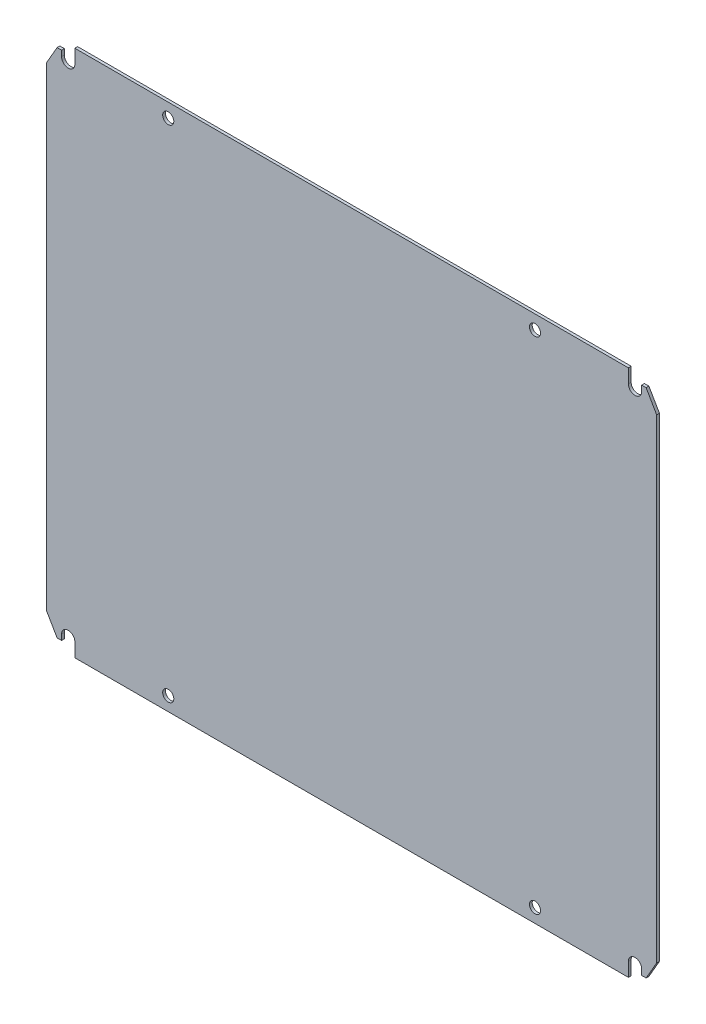
ISO-10303-21;
HEADER;
FILE_DESCRIPTION(('STEP AP214'),'2;1');
FILE_NAME('part.step','',(''),(''),'','','');
FILE_SCHEMA(('AUTOMOTIVE_DESIGN { 1 0 10303 214 1 1 1 1 }'));
ENDSEC;
DATA;
#1=APPLICATION_CONTEXT('core data for automotive mechanical design processes');
#2=APPLICATION_PROTOCOL_DEFINITION('international standard','automotive_design',2000,#1);
#3=PRODUCT_CONTEXT('',#1,'mechanical');
#4=PRODUCT('Part','Part','',(#3));
#5=PRODUCT_RELATED_PRODUCT_CATEGORY('part','',(#4));
#6=PRODUCT_DEFINITION_FORMATION('','',#4);
#7=PRODUCT_DEFINITION_CONTEXT('part definition',#1,'design');
#8=PRODUCT_DEFINITION('design','',#6,#7);
#9=PRODUCT_DEFINITION_SHAPE('','',#8);
#10=(LENGTH_UNIT() NAMED_UNIT(*) SI_UNIT(.MILLI.,.METRE.));
#11=(NAMED_UNIT(*) PLANE_ANGLE_UNIT() SI_UNIT($,.RADIAN.));
#12=(NAMED_UNIT(*) SI_UNIT($,.STERADIAN.) SOLID_ANGLE_UNIT());
#13=UNCERTAINTY_MEASURE_WITH_UNIT(LENGTH_MEASURE(1.E-05),#10,'distance_accuracy_value','');
#14=(GEOMETRIC_REPRESENTATION_CONTEXT(3) GLOBAL_UNCERTAINTY_ASSIGNED_CONTEXT((#13)) GLOBAL_UNIT_ASSIGNED_CONTEXT((#10,
#11,#12)) REPRESENTATION_CONTEXT('',''));
#15=CARTESIAN_POINT('',(0.,0.,0.));
#16=DIRECTION('',(0.,0.,1.));
#17=DIRECTION('',(1.,0.,0.));
#18=AXIS2_PLACEMENT_3D('',#15,#16,#17);
#19=CARTESIAN_POINT('',(-255.,0.,-2.5));
#20=DIRECTION('',(0.,0.,1.));
#21=DIRECTION('',(1.,0.,0.));
#22=AXIS2_PLACEMENT_3D('',#19,#20,#21);
#23=PLANE('',#22);
#24=DIRECTION('',(-0.500000000000001,-0.866025403784438,0.));
#25=VECTOR('',#24,1.);
#26=CARTESIAN_POINT('',(-265.,455.,-2.5));
#27=LINE('',#26,#25);
#28=CARTESIAN_POINT('',(-265.,455.,-2.5));
#29=VERTEX_POINT('',#28);
#30=CARTESIAN_POINT('',(-274.5,438.545517328096,-2.5));
#31=VERTEX_POINT('',#30);
#32=EDGE_CURVE('E240',#29,#31,#27,.T.);
#33=ORIENTED_EDGE('',*,*,#32,.F.);
#34=DIRECTION('',(1.,0.,0.));
#35=VECTOR('',#34,1.);
#36=CARTESIAN_POINT('',(-261.,455.,-2.5));
#37=LINE('',#36,#35);
#38=CARTESIAN_POINT('',(-261.,455.,-2.5));
#39=VERTEX_POINT('',#38);
#40=EDGE_CURVE('E254',#39,#29,#37,.F.);
#41=ORIENTED_EDGE('',*,*,#40,.F.);
#42=DIRECTION('',(0.,1.,0.));
#43=VECTOR('',#42,1.);
#44=CARTESIAN_POINT('',(-261.,450.,-2.5));
#45=LINE('',#44,#43);
#46=CARTESIAN_POINT('',(-261.,450.,-2.5));
#47=VERTEX_POINT('',#46);
#48=EDGE_CURVE('E261',#47,#39,#45,.T.);
#49=ORIENTED_EDGE('',*,*,#48,.F.);
#50=CARTESIAN_POINT('',(-255.,450.,-2.5));
#51=DIRECTION('',(0.,0.,-1.));
#52=DIRECTION('',(-1.,0.,0.));
#53=AXIS2_PLACEMENT_3D('',#50,#51,#52);
#54=CIRCLE('',#53,6.00000000000001);
#55=CARTESIAN_POINT('',(-249.,450.,-2.5));
#56=VERTEX_POINT('',#55);
#57=EDGE_CURVE('E269',#47,#56,#54,.F.);
#58=ORIENTED_EDGE('',*,*,#57,.T.);
#59=DIRECTION('',(0.,1.,0.));
#60=VECTOR('',#59,1.);
#61=CARTESIAN_POINT('',(-249.,462.5,-2.5));
#62=LINE('',#61,#60);
#63=CARTESIAN_POINT('',(-249.,462.5,-2.5));
#64=VERTEX_POINT('',#63);
#65=EDGE_CURVE('E266',#64,#56,#62,.F.);
#66=ORIENTED_EDGE('',*,*,#65,.F.);
#67=DIRECTION('',(1.,0.,0.));
#68=VECTOR('',#67,1.);
#69=CARTESIAN_POINT('',(249.,462.5,-2.5));
#70=LINE('',#69,#68);
#71=CARTESIAN_POINT('',(249.,462.5,-2.5));
#72=VERTEX_POINT('',#71);
#73=EDGE_CURVE('E273',#72,#64,#70,.F.);
#74=ORIENTED_EDGE('',*,*,#73,.F.);
#75=DIRECTION('',(0.,1.,0.));
#76=VECTOR('',#75,1.);
#77=CARTESIAN_POINT('',(249.,450.,-2.5));
#78=LINE('',#77,#76);
#79=CARTESIAN_POINT('',(249.,450.,-2.5));
#80=VERTEX_POINT('',#79);
#81=EDGE_CURVE('E278',#80,#72,#78,.T.);
#82=ORIENTED_EDGE('',*,*,#81,.F.);
#83=CARTESIAN_POINT('',(255.,450.,-2.5));
#84=DIRECTION('',(0.,0.,-1.));
#85=DIRECTION('',(-1.,0.,0.));
#86=AXIS2_PLACEMENT_3D('',#83,#84,#85);
#87=CIRCLE('',#86,6.00000000000001);
#88=CARTESIAN_POINT('',(261.,450.,-2.5));
#89=VERTEX_POINT('',#88);
#90=EDGE_CURVE('E286',#80,#89,#87,.F.);
#91=ORIENTED_EDGE('',*,*,#90,.T.);
#92=DIRECTION('',(0.,1.,0.));
#93=VECTOR('',#92,1.);
#94=CARTESIAN_POINT('',(261.,455.,-2.5));
#95=LINE('',#94,#93);
#96=CARTESIAN_POINT('',(261.,455.,-2.5));
#97=VERTEX_POINT('',#96);
#98=EDGE_CURVE('E283',#97,#89,#95,.F.);
#99=ORIENTED_EDGE('',*,*,#98,.F.);
#100=DIRECTION('',(1.,0.,0.));
#101=VECTOR('',#100,1.);
#102=CARTESIAN_POINT('',(265.,455.,-2.5));
#103=LINE('',#102,#101);
#104=CARTESIAN_POINT('',(265.,455.,-2.5));
#105=VERTEX_POINT('',#104);
#106=EDGE_CURVE('E290',#105,#97,#103,.F.);
#107=ORIENTED_EDGE('',*,*,#106,.F.);
#108=DIRECTION('',(-0.500000000000001,0.866025403784438,0.));
#109=VECTOR('',#108,1.);
#110=CARTESIAN_POINT('',(274.5,438.545517328096,-2.5));
#111=LINE('',#110,#109);
#112=CARTESIAN_POINT('',(274.5,438.545517328096,-2.5));
#113=VERTEX_POINT('',#112);
#114=EDGE_CURVE('E295',#113,#105,#111,.T.);
#115=ORIENTED_EDGE('',*,*,#114,.F.);
#116=DIRECTION('',(0.,1.,0.));
#117=VECTOR('',#116,1.);
#118=CARTESIAN_POINT('',(274.5,11.4544826719043,-2.5));
#119=LINE('',#118,#117);
#120=CARTESIAN_POINT('',(274.5,11.4544826719043,-2.5));
#121=VERTEX_POINT('',#120);
#122=EDGE_CURVE('E300',#121,#113,#119,.T.);
#123=ORIENTED_EDGE('',*,*,#122,.F.);
#124=DIRECTION('',(0.500000000000001,0.866025403784438,0.));
#125=VECTOR('',#124,1.);
#126=CARTESIAN_POINT('',(265.,-5.,-2.5));
#127=LINE('',#126,#125);
#128=CARTESIAN_POINT('',(265.,-5.,-2.5));
#129=VERTEX_POINT('',#128);
#130=EDGE_CURVE('E305',#129,#121,#127,.T.);
#131=ORIENTED_EDGE('',*,*,#130,.F.);
#132=DIRECTION('',(1.,0.,0.));
#133=VECTOR('',#132,1.);
#134=CARTESIAN_POINT('',(261.,-5.,-2.5));
#135=LINE('',#134,#133);
#136=CARTESIAN_POINT('',(261.,-5.,-2.5));
#137=VERTEX_POINT('',#136);
#138=EDGE_CURVE('E310',#137,#129,#135,.T.);
#139=ORIENTED_EDGE('',*,*,#138,.F.);
#140=DIRECTION('',(0.,1.,0.));
#141=VECTOR('',#140,1.);
#142=CARTESIAN_POINT('',(261.,0.,-2.5));
#143=LINE('',#142,#141);
#144=CARTESIAN_POINT('',(261.,0.,-2.5));
#145=VERTEX_POINT('',#144);
#146=EDGE_CURVE('E315',#145,#137,#143,.F.);
#147=ORIENTED_EDGE('',*,*,#146,.F.);
#148=CARTESIAN_POINT('',(255.,0.,-2.5));
#149=DIRECTION('',(0.,0.,-1.));
#150=DIRECTION('',(-1.,0.,0.));
#151=AXIS2_PLACEMENT_3D('',#148,#149,#150);
#152=CIRCLE('',#151,6.00000000000001);
#153=CARTESIAN_POINT('',(249.,0.,-2.5));
#154=VERTEX_POINT('',#153);
#155=EDGE_CURVE('E323',#145,#154,#152,.F.);
#156=ORIENTED_EDGE('',*,*,#155,.T.);
#157=DIRECTION('',(0.,1.,0.));
#158=VECTOR('',#157,1.);
#159=CARTESIAN_POINT('',(249.,-12.5,-2.5));
#160=LINE('',#159,#158);
#161=CARTESIAN_POINT('',(249.,-12.5,-2.5));
#162=VERTEX_POINT('',#161);
#163=EDGE_CURVE('E320',#162,#154,#160,.T.);
#164=ORIENTED_EDGE('',*,*,#163,.F.);
#165=DIRECTION('',(1.,0.,0.));
#166=VECTOR('',#165,1.);
#167=CARTESIAN_POINT('',(-249.,-12.5,-2.5));
#168=LINE('',#167,#166);
#169=CARTESIAN_POINT('',(-249.,-12.5,-2.5));
#170=VERTEX_POINT('',#169);
#171=EDGE_CURVE('E327',#170,#162,#168,.T.);
#172=ORIENTED_EDGE('',*,*,#171,.F.);
#173=DIRECTION('',(0.,1.,0.));
#174=VECTOR('',#173,1.);
#175=CARTESIAN_POINT('',(-249.,0.,-2.5));
#176=LINE('',#175,#174);
#177=CARTESIAN_POINT('',(-249.,0.,-2.5));
#178=VERTEX_POINT('',#177);
#179=EDGE_CURVE('E184',#178,#170,#176,.F.);
#180=ORIENTED_EDGE('',*,*,#179,.F.);
#181=CARTESIAN_POINT('',(-255.,0.,-2.5));
#182=DIRECTION('',(0.,0.,-1.));
#183=DIRECTION('',(-1.,0.,0.));
#184=AXIS2_PLACEMENT_3D('',#181,#182,#183);
#185=CIRCLE('',#184,6.00000000000001);
#186=CARTESIAN_POINT('',(-261.,0.,-2.5));
#187=VERTEX_POINT('',#186);
#188=EDGE_CURVE('E173',#178,#187,#185,.F.);
#189=ORIENTED_EDGE('',*,*,#188,.T.);
#190=DIRECTION('',(0.,1.,0.));
#191=VECTOR('',#190,1.);
#192=CARTESIAN_POINT('',(-261.,-5.,-2.5));
#193=LINE('',#192,#191);
#194=CARTESIAN_POINT('',(-261.,-5.,-2.5));
#195=VERTEX_POINT('',#194);
#196=EDGE_CURVE('E181',#195,#187,#193,.T.);
#197=ORIENTED_EDGE('',*,*,#196,.F.);
#198=DIRECTION('',(1.,0.,0.));
#199=VECTOR('',#198,1.);
#200=CARTESIAN_POINT('',(-265.,-5.,-2.5));
#201=LINE('',#200,#199);
#202=CARTESIAN_POINT('',(-265.,-5.,-2.5));
#203=VERTEX_POINT('',#202);
#204=EDGE_CURVE('E204',#203,#195,#201,.T.);
#205=ORIENTED_EDGE('',*,*,#204,.F.);
#206=DIRECTION('',(0.500000000000001,-0.866025403784438,0.));
#207=VECTOR('',#206,1.);
#208=CARTESIAN_POINT('',(-274.5,11.4544826719043,-2.5));
#209=LINE('',#208,#207);
#210=CARTESIAN_POINT('',(-274.5,11.4544826719043,-2.5));
#211=VERTEX_POINT('',#210);
#212=EDGE_CURVE('E217',#211,#203,#209,.T.);
#213=ORIENTED_EDGE('',*,*,#212,.F.);
#214=DIRECTION('',(0.,1.,0.));
#215=VECTOR('',#214,1.);
#216=CARTESIAN_POINT('',(-274.5,438.545517328096,-2.5));
#217=LINE('',#216,#215);
#218=EDGE_CURVE('E228',#31,#211,#217,.F.);
#219=ORIENTED_EDGE('',*,*,#218,.F.);
#220=EDGE_LOOP('',(#33,#41,#49,#58,#66,#74,#82,#91,#99,#107,#115,#123,#131,#139,#147,#156,#164,
#172,#180,#189,#197,#205,#213,#219));
#221=FACE_BOUND('',#220,.T.);
#222=CARTESIAN_POINT('',(165.,0.,-2.5));
#223=DIRECTION('',(0.,0.,-1.));
#224=DIRECTION('',(-1.,0.,0.));
#225=AXIS2_PLACEMENT_3D('',#222,#223,#224);
#226=CIRCLE('',#225,5.);
#227=CARTESIAN_POINT('',(160.,0.,-2.5));
#228=VERTEX_POINT('',#227);
#229=EDGE_CURVE('E246',#228,#228,#226,.F.);
#230=ORIENTED_EDGE('',*,*,#229,.T.);
#231=EDGE_LOOP('',(#230));
#232=FACE_BOUND('',#231,.T.);
#233=CARTESIAN_POINT('',(165.,450.,-2.5));
#234=DIRECTION('',(0.,0.,-1.));
#235=DIRECTION('',(-1.,0.,0.));
#236=AXIS2_PLACEMENT_3D('',#233,#234,#235);
#237=CIRCLE('',#236,5.);
#238=CARTESIAN_POINT('',(160.,450.,-2.5));
#239=VERTEX_POINT('',#238);
#240=EDGE_CURVE('E378',#239,#239,#237,.F.);
#241=ORIENTED_EDGE('',*,*,#240,.T.);
#242=EDGE_LOOP('',(#241));
#243=FACE_BOUND('',#242,.T.);
#244=CARTESIAN_POINT('',(-165.,0.,-2.5));
#245=DIRECTION('',(0.,0.,-1.));
#246=DIRECTION('',(-1.,0.,0.));
#247=AXIS2_PLACEMENT_3D('',#244,#245,#246);
#248=CIRCLE('',#247,5.);
#249=CARTESIAN_POINT('',(-170.,0.,-2.5));
#250=VERTEX_POINT('',#249);
#251=EDGE_CURVE('E380',#250,#250,#248,.F.);
#252=ORIENTED_EDGE('',*,*,#251,.T.);
#253=EDGE_LOOP('',(#252));
#254=FACE_BOUND('',#253,.T.);
#255=CARTESIAN_POINT('',(-165.,450.,-2.5));
#256=DIRECTION('',(0.,0.,-1.));
#257=DIRECTION('',(-1.,0.,0.));
#258=AXIS2_PLACEMENT_3D('',#255,#256,#257);
#259=CIRCLE('',#258,5.);
#260=CARTESIAN_POINT('',(-170.,450.,-2.5));
#261=VERTEX_POINT('',#260);
#262=EDGE_CURVE('E19',#261,#261,#259,.F.);
#263=ORIENTED_EDGE('',*,*,#262,.T.);
#264=EDGE_LOOP('',(#263));
#265=FACE_BOUND('',#264,.T.);
#266=ADVANCED_FACE('F16',(#221,#232,#243,#254,#265),#23,.F.);
#267=CARTESIAN_POINT('',(-165.,450.,-2.5));
#268=DIRECTION('',(0.,0.,-1.));
#269=DIRECTION('',(-1.,0.,0.));
#270=AXIS2_PLACEMENT_3D('',#267,#268,#269);
#271=CYLINDRICAL_SURFACE('',#270,5.);
#272=CARTESIAN_POINT('',(-165.,450.,0.));
#273=DIRECTION('',(0.,0.,-1.));
#274=DIRECTION('',(-1.,0.,0.));
#275=AXIS2_PLACEMENT_3D('',#272,#273,#274);
#276=CIRCLE('',#275,5.);
#277=CARTESIAN_POINT('',(-170.,450.,0.));
#278=VERTEX_POINT('',#277);
#279=EDGE_CURVE('E239',#278,#278,#276,.T.);
#280=ORIENTED_EDGE('',*,*,#279,.F.);
#281=EDGE_LOOP('',(#280));
#282=FACE_BOUND('',#281,.T.);
#283=ORIENTED_EDGE('',*,*,#262,.F.);
#284=EDGE_LOOP('',(#283));
#285=FACE_BOUND('',#284,.T.);
#286=ADVANCED_FACE('F388',(#282,#285),#271,.F.);
#287=CARTESIAN_POINT('',(-165.,0.,-2.5));
#288=DIRECTION('',(0.,0.,-1.));
#289=DIRECTION('',(-1.,0.,0.));
#290=AXIS2_PLACEMENT_3D('',#287,#288,#289);
#291=CYLINDRICAL_SURFACE('',#290,5.);
#292=CARTESIAN_POINT('',(-165.,0.,0.));
#293=DIRECTION('',(0.,0.,-1.));
#294=DIRECTION('',(-1.,0.,0.));
#295=AXIS2_PLACEMENT_3D('',#292,#293,#294);
#296=CIRCLE('',#295,5.);
#297=CARTESIAN_POINT('',(-170.,0.,0.));
#298=VERTEX_POINT('',#297);
#299=EDGE_CURVE('E365',#298,#298,#296,.T.);
#300=ORIENTED_EDGE('',*,*,#299,.F.);
#301=EDGE_LOOP('',(#300));
#302=FACE_BOUND('',#301,.T.);
#303=ORIENTED_EDGE('',*,*,#251,.F.);
#304=EDGE_LOOP('',(#303));
#305=FACE_BOUND('',#304,.T.);
#306=ADVANCED_FACE('F390',(#302,#305),#291,.F.);
#307=CARTESIAN_POINT('',(165.,450.,-2.5));
#308=DIRECTION('',(0.,0.,-1.));
#309=DIRECTION('',(-1.,0.,0.));
#310=AXIS2_PLACEMENT_3D('',#307,#308,#309);
#311=CYLINDRICAL_SURFACE('',#310,5.);
#312=CARTESIAN_POINT('',(165.,450.,0.));
#313=DIRECTION('',(0.,0.,-1.));
#314=DIRECTION('',(-1.,0.,0.));
#315=AXIS2_PLACEMENT_3D('',#312,#313,#314);
#316=CIRCLE('',#315,5.);
#317=CARTESIAN_POINT('',(160.,450.,0.));
#318=VERTEX_POINT('',#317);
#319=EDGE_CURVE('E362',#318,#318,#316,.T.);
#320=ORIENTED_EDGE('',*,*,#319,.F.);
#321=EDGE_LOOP('',(#320));
#322=FACE_BOUND('',#321,.T.);
#323=ORIENTED_EDGE('',*,*,#240,.F.);
#324=EDGE_LOOP('',(#323));
#325=FACE_BOUND('',#324,.T.);
#326=ADVANCED_FACE('F397',(#322,#325),#311,.F.);
#327=CARTESIAN_POINT('',(165.,0.,-2.5));
#328=DIRECTION('',(0.,0.,-1.));
#329=DIRECTION('',(-1.,0.,0.));
#330=AXIS2_PLACEMENT_3D('',#327,#328,#329);
#331=CYLINDRICAL_SURFACE('',#330,5.);
#332=CARTESIAN_POINT('',(165.,0.,0.));
#333=DIRECTION('',(0.,0.,-1.));
#334=DIRECTION('',(-1.,0.,0.));
#335=AXIS2_PLACEMENT_3D('',#332,#333,#334);
#336=CIRCLE('',#335,5.);
#337=CARTESIAN_POINT('',(160.,0.,0.));
#338=VERTEX_POINT('',#337);
#339=EDGE_CURVE('E233',#338,#338,#336,.T.);
#340=ORIENTED_EDGE('',*,*,#339,.F.);
#341=EDGE_LOOP('',(#340));
#342=FACE_BOUND('',#341,.T.);
#343=ORIENTED_EDGE('',*,*,#229,.F.);
#344=EDGE_LOOP('',(#343));
#345=FACE_BOUND('',#344,.T.);
#346=ADVANCED_FACE('F500',(#342,#345),#331,.F.);
#347=CARTESIAN_POINT('',(-274.5,438.545517328096,-2.5));
#348=DIRECTION('',(-1.,0.,0.));
#349=DIRECTION('',(0.,0.,1.));
#350=AXIS2_PLACEMENT_3D('',#347,#348,#349);
#351=PLANE('',#350);
#352=ORIENTED_EDGE('',*,*,#218,.T.);
#353=DIRECTION('',(0.,0.,1.));
#354=VECTOR('',#353,1.);
#355=CARTESIAN_POINT('',(-274.5,11.4544826719043,-2.5));
#356=LINE('',#355,#354);
#357=CARTESIAN_POINT('',(-274.5,11.4544826719043,0.));
#358=VERTEX_POINT('',#357);
#359=EDGE_CURVE('E225',#358,#211,#356,.F.);
#360=ORIENTED_EDGE('',*,*,#359,.F.);
#361=DIRECTION('',(0.,1.,0.));
#362=VECTOR('',#361,1.);
#363=CARTESIAN_POINT('',(-274.5,0.,0.));
#364=LINE('',#363,#362);
#365=CARTESIAN_POINT('',(-274.5,438.545517328096,0.));
#366=VERTEX_POINT('',#365);
#367=EDGE_CURVE('E222',#366,#358,#364,.F.);
#368=ORIENTED_EDGE('',*,*,#367,.F.);
#369=DIRECTION('',(0.,0.,1.));
#370=VECTOR('',#369,1.);
#371=CARTESIAN_POINT('',(-274.5,438.545517328096,-2.5));
#372=LINE('',#371,#370);
#373=EDGE_CURVE('E236',#31,#366,#372,.T.);
#374=ORIENTED_EDGE('',*,*,#373,.F.);
#375=EDGE_LOOP('',(#352,#360,#368,#374));
#376=FACE_BOUND('',#375,.T.);
#377=ADVANCED_FACE('F496',(#376),#351,.T.);
#378=CARTESIAN_POINT('',(-274.5,11.4544826719043,-2.5));
#379=DIRECTION('',(-0.866025403784438,-0.500000000000001,0.));
#380=DIRECTION('',(0.500000000000001,-0.866025403784438,0.));
#381=AXIS2_PLACEMENT_3D('',#378,#379,#380);
#382=PLANE('',#381);
#383=ORIENTED_EDGE('',*,*,#212,.T.);
#384=DIRECTION('',(0.,0.,-1.));
#385=VECTOR('',#384,1.);
#386=CARTESIAN_POINT('',(-265.,-5.,-2.5));
#387=LINE('',#386,#385);
#388=CARTESIAN_POINT('',(-265.,-5.,0.));
#389=VERTEX_POINT('',#388);
#390=EDGE_CURVE('E214',#389,#203,#387,.T.);
#391=ORIENTED_EDGE('',*,*,#390,.F.);
#392=DIRECTION('',(0.500000000000001,-0.866025403784438,0.));
#393=VECTOR('',#392,1.);
#394=CARTESIAN_POINT('',(-274.5,11.4544826719043,0.));
#395=LINE('',#394,#393);
#396=EDGE_CURVE('E211',#358,#389,#395,.T.);
#397=ORIENTED_EDGE('',*,*,#396,.F.);
#398=ORIENTED_EDGE('',*,*,#359,.T.);
#399=EDGE_LOOP('',(#383,#391,#397,#398));
#400=FACE_BOUND('',#399,.T.);
#401=ADVANCED_FACE('F492',(#400),#382,.T.);
#402=CARTESIAN_POINT('',(-265.,-5.,-2.5));
#403=DIRECTION('',(0.,-1.,0.));
#404=DIRECTION('',(0.,0.,-1.));
#405=AXIS2_PLACEMENT_3D('',#402,#403,#404);
#406=PLANE('',#405);
#407=ORIENTED_EDGE('',*,*,#204,.T.);
#408=DIRECTION('',(0.,0.,-1.));
#409=VECTOR('',#408,1.);
#410=CARTESIAN_POINT('',(-261.,-5.,-2.5));
#411=LINE('',#410,#409);
#412=CARTESIAN_POINT('',(-261.,-5.,0.));
#413=VERTEX_POINT('',#412);
#414=EDGE_CURVE('E192',#413,#195,#411,.T.);
#415=ORIENTED_EDGE('',*,*,#414,.F.);
#416=DIRECTION('',(1.,0.,0.));
#417=VECTOR('',#416,1.);
#418=CARTESIAN_POINT('',(-255.,-5.,0.));
#419=LINE('',#418,#417);
#420=EDGE_CURVE('E207',#389,#413,#419,.T.);
#421=ORIENTED_EDGE('',*,*,#420,.F.);
#422=ORIENTED_EDGE('',*,*,#390,.T.);
#423=EDGE_LOOP('',(#407,#415,#421,#422));
#424=FACE_BOUND('',#423,.T.);
#425=ADVANCED_FACE('F489',(#424),#406,.T.);
#426=CARTESIAN_POINT('',(-261.,-5.,-2.5));
#427=DIRECTION('',(1.,0.,0.));
#428=DIRECTION('',(0.,0.,-1.));
#429=AXIS2_PLACEMENT_3D('',#426,#427,#428);
#430=PLANE('',#429);
#431=ORIENTED_EDGE('',*,*,#196,.T.);
#432=DIRECTION('',(0.,0.,-1.));
#433=VECTOR('',#432,1.);
#434=CARTESIAN_POINT('',(-261.,0.,-2.5));
#435=LINE('',#434,#433);
#436=CARTESIAN_POINT('',(-261.,0.,0.));
#437=VERTEX_POINT('',#436);
#438=EDGE_CURVE('E186',#187,#437,#435,.F.);
#439=ORIENTED_EDGE('',*,*,#438,.T.);
#440=DIRECTION('',(0.,1.,0.));
#441=VECTOR('',#440,1.);
#442=CARTESIAN_POINT('',(-261.,0.,0.));
#443=LINE('',#442,#441);
#444=EDGE_CURVE('E210',#413,#437,#443,.T.);
#445=ORIENTED_EDGE('',*,*,#444,.F.);
#446=ORIENTED_EDGE('',*,*,#414,.T.);
#447=EDGE_LOOP('',(#431,#439,#445,#446));
#448=FACE_BOUND('',#447,.T.);
#449=ADVANCED_FACE('F189',(#448),#430,.T.);
#450=CARTESIAN_POINT('',(-255.,0.,-2.5));
#451=DIRECTION('',(0.,0.,-1.));
#452=DIRECTION('',(-1.,0.,0.));
#453=AXIS2_PLACEMENT_3D('',#450,#451,#452);
#454=CYLINDRICAL_SURFACE('',#453,6.00000000000001);
#455=ORIENTED_EDGE('',*,*,#438,.F.);
#456=ORIENTED_EDGE('',*,*,#188,.F.);
#457=DIRECTION('',(0.,0.,1.));
#458=VECTOR('',#457,1.);
#459=CARTESIAN_POINT('',(-249.,0.,-2.5));
#460=LINE('',#459,#458);
#461=CARTESIAN_POINT('',(-249.,0.,0.));
#462=VERTEX_POINT('',#461);
#463=EDGE_CURVE('E198',#462,#178,#460,.F.);
#464=ORIENTED_EDGE('',*,*,#463,.F.);
#465=CARTESIAN_POINT('',(-255.,0.,0.));
#466=DIRECTION('',(0.,0.,-1.));
#467=DIRECTION('',(-1.,0.,0.));
#468=AXIS2_PLACEMENT_3D('',#465,#466,#467);
#469=CIRCLE('',#468,6.00000000000001);
#470=EDGE_CURVE('E196',#437,#462,#469,.T.);
#471=ORIENTED_EDGE('',*,*,#470,.F.);
#472=EDGE_LOOP('',(#455,#456,#464,#471));
#473=FACE_BOUND('',#472,.T.);
#474=ADVANCED_FACE('F194',(#473),#454,.F.);
#475=CARTESIAN_POINT('',(-249.,0.,-2.5));
#476=DIRECTION('',(-1.,0.,0.));
#477=DIRECTION('',(0.,0.,1.));
#478=AXIS2_PLACEMENT_3D('',#475,#476,#477);
#479=PLANE('',#478);
#480=ORIENTED_EDGE('',*,*,#179,.T.);
#481=DIRECTION('',(0.,0.,-1.));
#482=VECTOR('',#481,1.);
#483=CARTESIAN_POINT('',(-249.,-12.5,-2.5));
#484=LINE('',#483,#482);
#485=CARTESIAN_POINT('',(-249.,-12.5,0.));
#486=VERTEX_POINT('',#485);
#487=EDGE_CURVE('E329',#486,#170,#484,.T.);
#488=ORIENTED_EDGE('',*,*,#487,.F.);
#489=DIRECTION('',(0.,1.,0.));
#490=VECTOR('',#489,1.);
#491=CARTESIAN_POINT('',(-249.,0.,0.));
#492=LINE('',#491,#490);
#493=EDGE_CURVE('E359',#462,#486,#492,.F.);
#494=ORIENTED_EDGE('',*,*,#493,.F.);
#495=ORIENTED_EDGE('',*,*,#463,.T.);
#496=EDGE_LOOP('',(#480,#488,#494,#495));
#497=FACE_BOUND('',#496,.T.);
#498=ADVANCED_FACE('F480',(#497),#479,.T.);
#499=CARTESIAN_POINT('',(-249.,-12.5,-2.5));
#500=DIRECTION('',(0.,-1.,0.));
#501=DIRECTION('',(0.,0.,-1.));
#502=AXIS2_PLACEMENT_3D('',#499,#500,#501);
#503=PLANE('',#502);
#504=ORIENTED_EDGE('',*,*,#171,.T.);
#505=DIRECTION('',(0.,0.,-1.));
#506=VECTOR('',#505,1.);
#507=CARTESIAN_POINT('',(249.,-12.5,-2.5));
#508=LINE('',#507,#506);
#509=CARTESIAN_POINT('',(249.,-12.5,0.));
#510=VERTEX_POINT('',#509);
#511=EDGE_CURVE('E324',#510,#162,#508,.T.);
#512=ORIENTED_EDGE('',*,*,#511,.F.);
#513=DIRECTION('',(1.,0.,0.));
#514=VECTOR('',#513,1.);
#515=CARTESIAN_POINT('',(-255.,-12.5,0.));
#516=LINE('',#515,#514);
#517=EDGE_CURVE('E856',#486,#510,#516,.T.);
#518=ORIENTED_EDGE('',*,*,#517,.F.);
#519=ORIENTED_EDGE('',*,*,#487,.T.);
#520=EDGE_LOOP('',(#504,#512,#518,#519));
#521=FACE_BOUND('',#520,.T.);
#522=ADVANCED_FACE('F476',(#521),#503,.T.);
#523=CARTESIAN_POINT('',(249.,-12.5,-2.5));
#524=DIRECTION('',(1.,0.,0.));
#525=DIRECTION('',(0.,0.,-1.));
#526=AXIS2_PLACEMENT_3D('',#523,#524,#525);
#527=PLANE('',#526);
#528=ORIENTED_EDGE('',*,*,#163,.T.);
#529=DIRECTION('',(0.,0.,-1.));
#530=VECTOR('',#529,1.);
#531=CARTESIAN_POINT('',(249.,0.,-2.5));
#532=LINE('',#531,#530);
#533=CARTESIAN_POINT('',(249.,0.,0.));
#534=VERTEX_POINT('',#533);
#535=EDGE_CURVE('E374',#154,#534,#532,.F.);
#536=ORIENTED_EDGE('',*,*,#535,.T.);
#537=DIRECTION('',(0.,1.,0.));
#538=VECTOR('',#537,1.);
#539=CARTESIAN_POINT('',(249.,0.,0.));
#540=LINE('',#539,#538);
#541=EDGE_CURVE('E357',#510,#534,#540,.T.);
#542=ORIENTED_EDGE('',*,*,#541,.F.);
#543=ORIENTED_EDGE('',*,*,#511,.T.);
#544=EDGE_LOOP('',(#528,#536,#542,#543));
#545=FACE_BOUND('',#544,.T.);
#546=ADVANCED_FACE('F472',(#545),#527,.T.);
#547=CARTESIAN_POINT('',(255.,0.,-2.5));
#548=DIRECTION('',(0.,0.,-1.));
#549=DIRECTION('',(-1.,0.,0.));
#550=AXIS2_PLACEMENT_3D('',#547,#548,#549);
#551=CYLINDRICAL_SURFACE('',#550,6.00000000000001);
#552=ORIENTED_EDGE('',*,*,#535,.F.);
#553=ORIENTED_EDGE('',*,*,#155,.F.);
#554=DIRECTION('',(0.,0.,1.));
#555=VECTOR('',#554,1.);
#556=CARTESIAN_POINT('',(261.,0.,-2.5));
#557=LINE('',#556,#555);
#558=CARTESIAN_POINT('',(261.,0.,0.));
#559=VERTEX_POINT('',#558);
#560=EDGE_CURVE('E317',#559,#145,#557,.F.);
#561=ORIENTED_EDGE('',*,*,#560,.F.);
#562=CARTESIAN_POINT('',(255.,0.,0.));
#563=DIRECTION('',(0.,0.,-1.));
#564=DIRECTION('',(-1.,0.,0.));
#565=AXIS2_PLACEMENT_3D('',#562,#563,#564);
#566=CIRCLE('',#565,6.00000000000001);
#567=EDGE_CURVE('E353',#534,#559,#566,.T.);
#568=ORIENTED_EDGE('',*,*,#567,.F.);
#569=EDGE_LOOP('',(#552,#553,#561,#568));
#570=FACE_BOUND('',#569,.T.);
#571=ADVANCED_FACE('F468',(#570),#551,.F.);
#572=CARTESIAN_POINT('',(261.,0.,-2.5));
#573=DIRECTION('',(-1.,0.,0.));
#574=DIRECTION('',(0.,0.,1.));
#575=AXIS2_PLACEMENT_3D('',#572,#573,#574);
#576=PLANE('',#575);
#577=ORIENTED_EDGE('',*,*,#146,.T.);
#578=DIRECTION('',(0.,0.,-1.));
#579=VECTOR('',#578,1.);
#580=CARTESIAN_POINT('',(261.,-5.,-2.5));
#581=LINE('',#580,#579);
#582=CARTESIAN_POINT('',(261.,-5.,0.));
#583=VERTEX_POINT('',#582);
#584=EDGE_CURVE('E312',#583,#137,#581,.T.);
#585=ORIENTED_EDGE('',*,*,#584,.F.);
#586=DIRECTION('',(0.,1.,0.));
#587=VECTOR('',#586,1.);
#588=CARTESIAN_POINT('',(261.,0.,0.));
#589=LINE('',#588,#587);
#590=EDGE_CURVE('E356',#559,#583,#589,.F.);
#591=ORIENTED_EDGE('',*,*,#590,.F.);
#592=ORIENTED_EDGE('',*,*,#560,.T.);
#593=EDGE_LOOP('',(#577,#585,#591,#592));
#594=FACE_BOUND('',#593,.T.);
#595=ADVANCED_FACE('F464',(#594),#576,.T.);
#596=CARTESIAN_POINT('',(261.,-5.,-2.5));
#597=DIRECTION('',(0.,-1.,0.));
#598=DIRECTION('',(0.,0.,-1.));
#599=AXIS2_PLACEMENT_3D('',#596,#597,#598);
#600=PLANE('',#599);
#601=ORIENTED_EDGE('',*,*,#138,.T.);
#602=DIRECTION('',(0.,0.,1.));
#603=VECTOR('',#602,1.);
#604=CARTESIAN_POINT('',(265.,-5.,-2.5));
#605=LINE('',#604,#603);
#606=CARTESIAN_POINT('',(265.,-4.99999999999997,0.));
#607=VERTEX_POINT('',#606);
#608=EDGE_CURVE('E307',#607,#129,#605,.F.);
#609=ORIENTED_EDGE('',*,*,#608,.F.);
#610=DIRECTION('',(1.,0.,0.));
#611=VECTOR('',#610,1.);
#612=CARTESIAN_POINT('',(-255.,-5.,0.));
#613=LINE('',#612,#611);
#614=EDGE_CURVE('E834',#583,#607,#613,.T.);
#615=ORIENTED_EDGE('',*,*,#614,.F.);
#616=ORIENTED_EDGE('',*,*,#584,.T.);
#617=EDGE_LOOP('',(#601,#609,#615,#616));
#618=FACE_BOUND('',#617,.T.);
#619=ADVANCED_FACE('F460',(#618),#600,.T.);
#620=CARTESIAN_POINT('',(265.,-5.,-2.5));
#621=DIRECTION('',(0.866025403784438,-0.500000000000001,0.));
#622=DIRECTION('',(0.500000000000001,0.866025403784438,0.));
#623=AXIS2_PLACEMENT_3D('',#620,#621,#622);
#624=PLANE('',#623);
#625=ORIENTED_EDGE('',*,*,#130,.T.);
#626=DIRECTION('',(0.,0.,-1.));
#627=VECTOR('',#626,1.);
#628=CARTESIAN_POINT('',(274.5,11.4544826719043,-2.5));
#629=LINE('',#628,#627);
#630=CARTESIAN_POINT('',(274.5,11.4544826719043,0.));
#631=VERTEX_POINT('',#630);
#632=EDGE_CURVE('E302',#631,#121,#629,.T.);
#633=ORIENTED_EDGE('',*,*,#632,.F.);
#634=DIRECTION('',(0.500000000000003,0.866025403784437,0.));
#635=VECTOR('',#634,1.);
#636=CARTESIAN_POINT('',(265.,-5.,0.));
#637=LINE('',#636,#635);
#638=EDGE_CURVE('E825',#607,#631,#637,.T.);
#639=ORIENTED_EDGE('',*,*,#638,.F.);
#640=ORIENTED_EDGE('',*,*,#608,.T.);
#641=EDGE_LOOP('',(#625,#633,#639,#640));
#642=FACE_BOUND('',#641,.T.);
#643=ADVANCED_FACE('F456',(#642),#624,.T.);
#644=CARTESIAN_POINT('',(274.5,11.4544826719043,-2.5));
#645=DIRECTION('',(1.,0.,0.));
#646=DIRECTION('',(0.,0.,-1.));
#647=AXIS2_PLACEMENT_3D('',#644,#645,#646);
#648=PLANE('',#647);
#649=ORIENTED_EDGE('',*,*,#122,.T.);
#650=DIRECTION('',(0.,0.,1.));
#651=VECTOR('',#650,1.);
#652=CARTESIAN_POINT('',(274.5,438.545517328096,-2.5));
#653=LINE('',#652,#651);
#654=CARTESIAN_POINT('',(274.5,438.545517328096,0.));
#655=VERTEX_POINT('',#654);
#656=EDGE_CURVE('E297',#655,#113,#653,.F.);
#657=ORIENTED_EDGE('',*,*,#656,.F.);
#658=DIRECTION('',(0.,1.,0.));
#659=VECTOR('',#658,1.);
#660=CARTESIAN_POINT('',(274.5,0.,0.));
#661=LINE('',#660,#659);
#662=EDGE_CURVE('E816',#631,#655,#661,.T.);
#663=ORIENTED_EDGE('',*,*,#662,.F.);
#664=ORIENTED_EDGE('',*,*,#632,.T.);
#665=EDGE_LOOP('',(#649,#657,#663,#664));
#666=FACE_BOUND('',#665,.T.);
#667=ADVANCED_FACE('F452',(#666),#648,.T.);
#668=CARTESIAN_POINT('',(274.5,438.545517328096,-2.5));
#669=DIRECTION('',(0.866025403784438,0.500000000000001,0.));
#670=DIRECTION('',(-0.500000000000001,0.866025403784438,0.));
#671=AXIS2_PLACEMENT_3D('',#668,#669,#670);
#672=PLANE('',#671);
#673=ORIENTED_EDGE('',*,*,#114,.T.);
#674=DIRECTION('',(0.,0.,1.));
#675=VECTOR('',#674,1.);
#676=CARTESIAN_POINT('',(265.,455.,-2.5));
#677=LINE('',#676,#675);
#678=CARTESIAN_POINT('',(265.,455.,0.));
#679=VERTEX_POINT('',#678);
#680=EDGE_CURVE('E292',#679,#105,#677,.F.);
#681=ORIENTED_EDGE('',*,*,#680,.F.);
#682=DIRECTION('',(-0.500000000000011,0.866025403784432,0.));
#683=VECTOR('',#682,1.);
#684=CARTESIAN_POINT('',(274.5,438.545517328096,0.));
#685=LINE('',#684,#683);
#686=EDGE_CURVE('E807',#655,#679,#685,.T.);
#687=ORIENTED_EDGE('',*,*,#686,.F.);
#688=ORIENTED_EDGE('',*,*,#656,.T.);
#689=EDGE_LOOP('',(#673,#681,#687,#688));
#690=FACE_BOUND('',#689,.T.);
#691=ADVANCED_FACE('F448',(#690),#672,.T.);
#692=CARTESIAN_POINT('',(265.,455.,-2.5));
#693=DIRECTION('',(0.,1.,0.));
#694=DIRECTION('',(0.,0.,1.));
#695=AXIS2_PLACEMENT_3D('',#692,#693,#694);
#696=PLANE('',#695);
#697=ORIENTED_EDGE('',*,*,#106,.T.);
#698=DIRECTION('',(0.,0.,1.));
#699=VECTOR('',#698,1.);
#700=CARTESIAN_POINT('',(261.,455.,-2.5));
#701=LINE('',#700,#699);
#702=CARTESIAN_POINT('',(261.,455.,0.));
#703=VERTEX_POINT('',#702);
#704=EDGE_CURVE('E287',#703,#97,#701,.F.);
#705=ORIENTED_EDGE('',*,*,#704,.F.);
#706=DIRECTION('',(1.,0.,0.));
#707=VECTOR('',#706,1.);
#708=CARTESIAN_POINT('',(-255.,455.,0.));
#709=LINE('',#708,#707);
#710=EDGE_CURVE('E804',#679,#703,#709,.F.);
#711=ORIENTED_EDGE('',*,*,#710,.F.);
#712=ORIENTED_EDGE('',*,*,#680,.T.);
#713=EDGE_LOOP('',(#697,#705,#711,#712));
#714=FACE_BOUND('',#713,.T.);
#715=ADVANCED_FACE('F444',(#714),#696,.T.);
#716=CARTESIAN_POINT('',(261.,455.,-2.5));
#717=DIRECTION('',(-1.,0.,0.));
#718=DIRECTION('',(0.,0.,1.));
#719=AXIS2_PLACEMENT_3D('',#716,#717,#718);
#720=PLANE('',#719);
#721=ORIENTED_EDGE('',*,*,#98,.T.);
#722=DIRECTION('',(0.,0.,-1.));
#723=VECTOR('',#722,1.);
#724=CARTESIAN_POINT('',(261.,450.,-2.5));
#725=LINE('',#724,#723);
#726=CARTESIAN_POINT('',(261.,450.,0.));
#727=VERTEX_POINT('',#726);
#728=EDGE_CURVE('E373',#89,#727,#725,.F.);
#729=ORIENTED_EDGE('',*,*,#728,.T.);
#730=DIRECTION('',(0.,1.,0.));
#731=VECTOR('',#730,1.);
#732=CARTESIAN_POINT('',(261.,0.,0.));
#733=LINE('',#732,#731);
#734=EDGE_CURVE('E352',#703,#727,#733,.F.);
#735=ORIENTED_EDGE('',*,*,#734,.F.);
#736=ORIENTED_EDGE('',*,*,#704,.T.);
#737=EDGE_LOOP('',(#721,#729,#735,#736));
#738=FACE_BOUND('',#737,.T.);
#739=ADVANCED_FACE('F440',(#738),#720,.T.);
#740=CARTESIAN_POINT('',(255.,450.,-2.5));
#741=DIRECTION('',(0.,0.,-1.));
#742=DIRECTION('',(-1.,0.,0.));
#743=AXIS2_PLACEMENT_3D('',#740,#741,#742);
#744=CYLINDRICAL_SURFACE('',#743,6.00000000000001);
#745=ORIENTED_EDGE('',*,*,#728,.F.);
#746=ORIENTED_EDGE('',*,*,#90,.F.);
#747=DIRECTION('',(0.,0.,-1.));
#748=VECTOR('',#747,1.);
#749=CARTESIAN_POINT('',(249.,450.,-2.5));
#750=LINE('',#749,#748);
#751=CARTESIAN_POINT('',(249.,450.,0.));
#752=VERTEX_POINT('',#751);
#753=EDGE_CURVE('E280',#752,#80,#750,.T.);
#754=ORIENTED_EDGE('',*,*,#753,.F.);
#755=CARTESIAN_POINT('',(255.,450.,0.));
#756=DIRECTION('',(0.,0.,-1.));
#757=DIRECTION('',(-1.,0.,0.));
#758=AXIS2_PLACEMENT_3D('',#755,#756,#757);
#759=CIRCLE('',#758,6.00000000000001);
#760=EDGE_CURVE('E348',#727,#752,#759,.T.);
#761=ORIENTED_EDGE('',*,*,#760,.F.);
#762=EDGE_LOOP('',(#745,#746,#754,#761));
#763=FACE_BOUND('',#762,.T.);
#764=ADVANCED_FACE('F436',(#763),#744,.F.);
#765=CARTESIAN_POINT('',(249.,450.,-2.5));
#766=DIRECTION('',(1.,0.,0.));
#767=DIRECTION('',(0.,0.,-1.));
#768=AXIS2_PLACEMENT_3D('',#765,#766,#767);
#769=PLANE('',#768);
#770=ORIENTED_EDGE('',*,*,#81,.T.);
#771=DIRECTION('',(0.,0.,1.));
#772=VECTOR('',#771,1.);
#773=CARTESIAN_POINT('',(249.,462.5,-2.5));
#774=LINE('',#773,#772);
#775=CARTESIAN_POINT('',(249.,462.5,0.));
#776=VERTEX_POINT('',#775);
#777=EDGE_CURVE('E275',#776,#72,#774,.F.);
#778=ORIENTED_EDGE('',*,*,#777,.F.);
#779=DIRECTION('',(0.,1.,0.));
#780=VECTOR('',#779,1.);
#781=CARTESIAN_POINT('',(249.,0.,0.));
#782=LINE('',#781,#780);
#783=EDGE_CURVE('E351',#752,#776,#782,.T.);
#784=ORIENTED_EDGE('',*,*,#783,.F.);
#785=ORIENTED_EDGE('',*,*,#753,.T.);
#786=EDGE_LOOP('',(#770,#778,#784,#785));
#787=FACE_BOUND('',#786,.T.);
#788=ADVANCED_FACE('F432',(#787),#769,.T.);
#789=CARTESIAN_POINT('',(249.,462.5,-2.5));
#790=DIRECTION('',(0.,1.,0.));
#791=DIRECTION('',(0.,0.,1.));
#792=AXIS2_PLACEMENT_3D('',#789,#790,#791);
#793=PLANE('',#792);
#794=ORIENTED_EDGE('',*,*,#73,.T.);
#795=DIRECTION('',(0.,0.,1.));
#796=VECTOR('',#795,1.);
#797=CARTESIAN_POINT('',(-249.,462.5,-2.5));
#798=LINE('',#797,#796);
#799=CARTESIAN_POINT('',(-249.,462.5,0.));
#800=VERTEX_POINT('',#799);
#801=EDGE_CURVE('E270',#800,#64,#798,.F.);
#802=ORIENTED_EDGE('',*,*,#801,.F.);
#803=DIRECTION('',(1.,0.,0.));
#804=VECTOR('',#803,1.);
#805=CARTESIAN_POINT('',(-255.,462.5,0.));
#806=LINE('',#805,#804);
#807=EDGE_CURVE('E788',#776,#800,#806,.F.);
#808=ORIENTED_EDGE('',*,*,#807,.F.);
#809=ORIENTED_EDGE('',*,*,#777,.T.);
#810=EDGE_LOOP('',(#794,#802,#808,#809));
#811=FACE_BOUND('',#810,.T.);
#812=ADVANCED_FACE('F428',(#811),#793,.T.);
#813=CARTESIAN_POINT('',(-249.,462.5,-2.5));
#814=DIRECTION('',(-1.,0.,0.));
#815=DIRECTION('',(0.,0.,1.));
#816=AXIS2_PLACEMENT_3D('',#813,#814,#815);
#817=PLANE('',#816);
#818=ORIENTED_EDGE('',*,*,#65,.T.);
#819=DIRECTION('',(0.,0.,-1.));
#820=VECTOR('',#819,1.);
#821=CARTESIAN_POINT('',(-249.,450.,-2.5));
#822=LINE('',#821,#820);
#823=CARTESIAN_POINT('',(-249.,450.,0.));
#824=VERTEX_POINT('',#823);
#825=EDGE_CURVE('E371',#56,#824,#822,.F.);
#826=ORIENTED_EDGE('',*,*,#825,.T.);
#827=DIRECTION('',(0.,1.,0.));
#828=VECTOR('',#827,1.);
#829=CARTESIAN_POINT('',(-249.,0.,0.));
#830=LINE('',#829,#828);
#831=EDGE_CURVE('E347',#800,#824,#830,.F.);
#832=ORIENTED_EDGE('',*,*,#831,.F.);
#833=ORIENTED_EDGE('',*,*,#801,.T.);
#834=EDGE_LOOP('',(#818,#826,#832,#833));
#835=FACE_BOUND('',#834,.T.);
#836=ADVANCED_FACE('F424',(#835),#817,.T.);
#837=CARTESIAN_POINT('',(-255.,450.,-2.5));
#838=DIRECTION('',(0.,0.,-1.));
#839=DIRECTION('',(-1.,0.,0.));
#840=AXIS2_PLACEMENT_3D('',#837,#838,#839);
#841=CYLINDRICAL_SURFACE('',#840,6.00000000000001);
#842=ORIENTED_EDGE('',*,*,#825,.F.);
#843=ORIENTED_EDGE('',*,*,#57,.F.);
#844=DIRECTION('',(0.,0.,-1.));
#845=VECTOR('',#844,1.);
#846=CARTESIAN_POINT('',(-261.,450.,-2.5));
#847=LINE('',#846,#845);
#848=CARTESIAN_POINT('',(-261.,450.,0.));
#849=VERTEX_POINT('',#848);
#850=EDGE_CURVE('E263',#849,#47,#847,.T.);
#851=ORIENTED_EDGE('',*,*,#850,.F.);
#852=CARTESIAN_POINT('',(-255.,450.,0.));
#853=DIRECTION('',(0.,0.,-1.));
#854=DIRECTION('',(-1.,0.,0.));
#855=AXIS2_PLACEMENT_3D('',#852,#853,#854);
#856=CIRCLE('',#855,6.00000000000001);
#857=EDGE_CURVE('E343',#824,#849,#856,.T.);
#858=ORIENTED_EDGE('',*,*,#857,.F.);
#859=EDGE_LOOP('',(#842,#843,#851,#858));
#860=FACE_BOUND('',#859,.T.);
#861=ADVANCED_FACE('F420',(#860),#841,.F.);
#862=CARTESIAN_POINT('',(-261.,450.,-2.5));
#863=DIRECTION('',(1.,0.,0.));
#864=DIRECTION('',(0.,0.,-1.));
#865=AXIS2_PLACEMENT_3D('',#862,#863,#864);
#866=PLANE('',#865);
#867=ORIENTED_EDGE('',*,*,#48,.T.);
#868=DIRECTION('',(0.,0.,1.));
#869=VECTOR('',#868,1.);
#870=CARTESIAN_POINT('',(-261.,455.,-2.5));
#871=LINE('',#870,#869);
#872=CARTESIAN_POINT('',(-261.,455.,0.));
#873=VERTEX_POINT('',#872);
#874=EDGE_CURVE('E258',#873,#39,#871,.F.);
#875=ORIENTED_EDGE('',*,*,#874,.F.);
#876=DIRECTION('',(0.,1.,0.));
#877=VECTOR('',#876,1.);
#878=CARTESIAN_POINT('',(-261.,0.,0.));
#879=LINE('',#878,#877);
#880=EDGE_CURVE('E346',#849,#873,#879,.T.);
#881=ORIENTED_EDGE('',*,*,#880,.F.);
#882=ORIENTED_EDGE('',*,*,#850,.T.);
#883=EDGE_LOOP('',(#867,#875,#881,#882));
#884=FACE_BOUND('',#883,.T.);
#885=ADVANCED_FACE('F417',(#884),#866,.T.);
#886=CARTESIAN_POINT('',(-261.,455.,-2.5));
#887=DIRECTION('',(0.,1.,0.));
#888=DIRECTION('',(0.,0.,1.));
#889=AXIS2_PLACEMENT_3D('',#886,#887,#888);
#890=PLANE('',#889);
#891=ORIENTED_EDGE('',*,*,#40,.T.);
#892=DIRECTION('',(0.,0.,1.));
#893=VECTOR('',#892,1.);
#894=CARTESIAN_POINT('',(-265.,455.,-2.5));
#895=LINE('',#894,#893);
#896=CARTESIAN_POINT('',(-265.,455.,0.));
#897=VERTEX_POINT('',#896);
#898=EDGE_CURVE('E34',#897,#29,#895,.F.);
#899=ORIENTED_EDGE('',*,*,#898,.F.);
#900=DIRECTION('',(1.,0.,0.));
#901=VECTOR('',#900,1.);
#902=CARTESIAN_POINT('',(-255.,455.,0.));
#903=LINE('',#902,#901);
#904=EDGE_CURVE('E25',#873,#897,#903,.F.);
#905=ORIENTED_EDGE('',*,*,#904,.F.);
#906=ORIENTED_EDGE('',*,*,#874,.T.);
#907=EDGE_LOOP('',(#891,#899,#905,#906));
#908=FACE_BOUND('',#907,.T.);
#909=ADVANCED_FACE('F409',(#908),#890,.T.);
#910=CARTESIAN_POINT('',(-265.,455.,-2.5));
#911=DIRECTION('',(-0.866025403784438,0.500000000000001,0.));
#912=DIRECTION('',(-0.500000000000001,-0.866025403784438,0.));
#913=AXIS2_PLACEMENT_3D('',#910,#911,#912);
#914=PLANE('',#913);
#915=ORIENTED_EDGE('',*,*,#32,.T.);
#916=ORIENTED_EDGE('',*,*,#373,.T.);
#917=DIRECTION('',(-0.500000000000009,-0.866025403784434,0.));
#918=VECTOR('',#917,1.);
#919=CARTESIAN_POINT('',(-265.,455.,0.));
#920=LINE('',#919,#918);
#921=EDGE_CURVE('E11',#897,#366,#920,.T.);
#922=ORIENTED_EDGE('',*,*,#921,.F.);
#923=ORIENTED_EDGE('',*,*,#898,.T.);
#924=EDGE_LOOP('',(#915,#916,#922,#923));
#925=FACE_BOUND('',#924,.T.);
#926=ADVANCED_FACE('F403',(#925),#914,.T.);
#927=CARTESIAN_POINT('',(-255.,0.,0.));
#928=DIRECTION('',(0.,0.,1.));
#929=DIRECTION('',(1.,0.,0.));
#930=AXIS2_PLACEMENT_3D('',#927,#928,#929);
#931=PLANE('',#930);
#932=ORIENTED_EDGE('',*,*,#904,.T.);
#933=ORIENTED_EDGE('',*,*,#921,.T.);
#934=ORIENTED_EDGE('',*,*,#367,.T.);
#935=ORIENTED_EDGE('',*,*,#396,.T.);
#936=ORIENTED_EDGE('',*,*,#420,.T.);
#937=ORIENTED_EDGE('',*,*,#444,.T.);
#938=ORIENTED_EDGE('',*,*,#470,.T.);
#939=ORIENTED_EDGE('',*,*,#493,.T.);
#940=ORIENTED_EDGE('',*,*,#517,.T.);
#941=ORIENTED_EDGE('',*,*,#541,.T.);
#942=ORIENTED_EDGE('',*,*,#567,.T.);
#943=ORIENTED_EDGE('',*,*,#590,.T.);
#944=ORIENTED_EDGE('',*,*,#614,.T.);
#945=ORIENTED_EDGE('',*,*,#638,.T.);
#946=ORIENTED_EDGE('',*,*,#662,.T.);
#947=ORIENTED_EDGE('',*,*,#686,.T.);
#948=ORIENTED_EDGE('',*,*,#710,.T.);
#949=ORIENTED_EDGE('',*,*,#734,.T.);
#950=ORIENTED_EDGE('',*,*,#760,.T.);
#951=ORIENTED_EDGE('',*,*,#783,.T.);
#952=ORIENTED_EDGE('',*,*,#807,.T.);
#953=ORIENTED_EDGE('',*,*,#831,.T.);
#954=ORIENTED_EDGE('',*,*,#857,.T.);
#955=ORIENTED_EDGE('',*,*,#880,.T.);
#956=EDGE_LOOP('',(#932,#933,#934,#935,#936,#937,#938,#939,#940,#941,#942,#943,#944,#945,#946,
#947,#948,#949,#950,#951,#952,#953,#954,#955));
#957=FACE_BOUND('',#956,.T.);
#958=ORIENTED_EDGE('',*,*,#339,.T.);
#959=EDGE_LOOP('',(#958));
#960=FACE_BOUND('',#959,.T.);
#961=ORIENTED_EDGE('',*,*,#319,.T.);
#962=EDGE_LOOP('',(#961));
#963=FACE_BOUND('',#962,.T.);
#964=ORIENTED_EDGE('',*,*,#299,.T.);
#965=EDGE_LOOP('',(#964));
#966=FACE_BOUND('',#965,.T.);
#967=ORIENTED_EDGE('',*,*,#279,.T.);
#968=EDGE_LOOP('',(#967));
#969=FACE_BOUND('',#968,.T.);
#970=ADVANCED_FACE('F401',(#957,#960,#963,#966,#969),#931,.T.);
#971=CLOSED_SHELL('',(#266,#286,#306,#326,#346,#377,#401,#425,#449,#474,#498,#522,#546,#571,
#595,#619,#643,#667,#691,#715,#739,#764,#788,#812,#836,#861,#885,#909,#926,#970));
#972=MANIFOLD_SOLID_BREP('B1',#971);
#973=ADVANCED_BREP_SHAPE_REPRESENTATION('',(#18,#972),#14);
#974=SHAPE_DEFINITION_REPRESENTATION(#9,#973);
ENDSEC;
END-ISO-10303-21;
